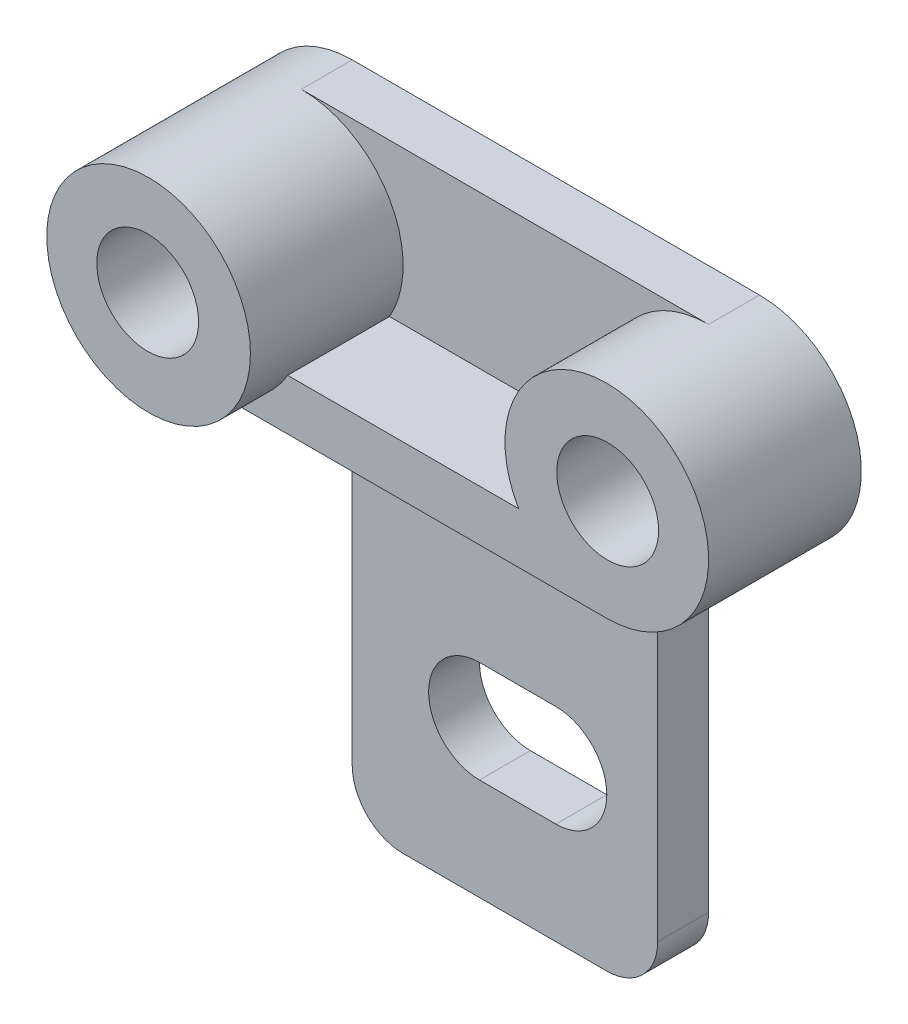
ISO-10303-21;
HEADER;
FILE_DESCRIPTION(('STEP AP214'),'2;1');
FILE_NAME('part.step','',(''),(''),'','','');
FILE_SCHEMA(('AUTOMOTIVE_DESIGN { 1 0 10303 214 1 1 1 1 }'));
ENDSEC;
DATA;
#1=APPLICATION_CONTEXT('core data for automotive mechanical design processes');
#2=APPLICATION_PROTOCOL_DEFINITION('international standard','automotive_design',2000,#1);
#3=PRODUCT_CONTEXT('',#1,'mechanical');
#4=PRODUCT('Part','Part','',(#3));
#5=PRODUCT_RELATED_PRODUCT_CATEGORY('part','',(#4));
#6=PRODUCT_DEFINITION_FORMATION('','',#4);
#7=PRODUCT_DEFINITION_CONTEXT('part definition',#1,'design');
#8=PRODUCT_DEFINITION('design','',#6,#7);
#9=PRODUCT_DEFINITION_SHAPE('','',#8);
#10=(LENGTH_UNIT() NAMED_UNIT(*) SI_UNIT(.MILLI.,.METRE.));
#11=(NAMED_UNIT(*) PLANE_ANGLE_UNIT() SI_UNIT($,.RADIAN.));
#12=(NAMED_UNIT(*) SI_UNIT($,.STERADIAN.) SOLID_ANGLE_UNIT());
#13=UNCERTAINTY_MEASURE_WITH_UNIT(LENGTH_MEASURE(1.E-05),#10,'distance_accuracy_value','');
#14=(GEOMETRIC_REPRESENTATION_CONTEXT(3) GLOBAL_UNCERTAINTY_ASSIGNED_CONTEXT((#13)) GLOBAL_UNIT_ASSIGNED_CONTEXT((#10,
#11,#12)) REPRESENTATION_CONTEXT('',''));
#15=CARTESIAN_POINT('',(0.,0.,0.));
#16=DIRECTION('',(0.,0.,1.));
#17=DIRECTION('',(1.,0.,0.));
#18=AXIS2_PLACEMENT_3D('',#15,#16,#17);
#19=CARTESIAN_POINT('',(-40.,0.,40.));
#20=DIRECTION('',(0.,0.,-1.));
#21=DIRECTION('',(-1.,0.,0.));
#22=AXIS2_PLACEMENT_3D('',#19,#20,#21);
#23=CYLINDRICAL_SURFACE('',#22,20.);
#24=CARTESIAN_POINT('',(-40.,0.,30.));
#25=DIRECTION('',(0.,0.,1.));
#26=DIRECTION('',(1.,0.,0.));
#27=AXIS2_PLACEMENT_3D('',#24,#25,#26);
#28=CIRCLE('',#27,20.);
#29=CARTESIAN_POINT('',(-40.,-20.,30.));
#30=VERTEX_POINT('',#29);
#31=CARTESIAN_POINT('',(-22.6794919243112,-9.99999999999999,30.));
#32=VERTEX_POINT('',#31);
#33=EDGE_CURVE('E260',#30,#32,#28,.T.);
#34=ORIENTED_EDGE('',*,*,#33,.T.);
#35=DIRECTION('',(0.,0.,-1.));
#36=VECTOR('',#35,1.);
#37=CARTESIAN_POINT('',(-22.6794919243112,-9.99999999999999,40.));
#38=LINE('',#37,#36);
#39=CARTESIAN_POINT('',(-22.6794919243112,-9.99999999999999,10.));
#40=VERTEX_POINT('',#39);
#41=EDGE_CURVE('E255',#32,#40,#38,.T.);
#42=ORIENTED_EDGE('',*,*,#41,.T.);
#43=CARTESIAN_POINT('',(-40.,0.,10.));
#44=DIRECTION('',(0.,0.,-1.));
#45=DIRECTION('',(-1.,0.,0.));
#46=AXIS2_PLACEMENT_3D('',#43,#44,#45);
#47=CIRCLE('',#46,20.);
#48=CARTESIAN_POINT('',(-40.,20.,10.));
#49=VERTEX_POINT('',#48);
#50=EDGE_CURVE('E50',#49,#40,#47,.T.);
#51=ORIENTED_EDGE('',*,*,#50,.F.);
#52=DIRECTION('',(0.,0.,-1.));
#53=VECTOR('',#52,1.);
#54=CARTESIAN_POINT('',(-40.,20.,10.));
#55=LINE('',#54,#53);
#56=CARTESIAN_POINT('',(-40.,20.,0.));
#57=VERTEX_POINT('',#56);
#58=EDGE_CURVE('E278',#49,#57,#55,.T.);
#59=ORIENTED_EDGE('',*,*,#58,.T.);
#60=CARTESIAN_POINT('',(-40.,0.,0.));
#61=DIRECTION('',(0.,0.,1.));
#62=DIRECTION('',(1.,0.,0.));
#63=AXIS2_PLACEMENT_3D('',#60,#61,#62);
#64=CIRCLE('',#63,20.);
#65=CARTESIAN_POINT('',(-40.,-20.,0.));
#66=VERTEX_POINT('',#65);
#67=EDGE_CURVE('E276',#57,#66,#64,.T.);
#68=ORIENTED_EDGE('',*,*,#67,.T.);
#69=DIRECTION('',(0.,0.,-1.));
#70=VECTOR('',#69,1.);
#71=CARTESIAN_POINT('',(-40.,-20.,10.));
#72=LINE('',#71,#70);
#73=EDGE_CURVE('E281',#30,#66,#72,.T.);
#74=ORIENTED_EDGE('',*,*,#73,.F.);
#75=EDGE_LOOP('',(#34,#42,#51,#59,#68,#74));
#76=FACE_BOUND('',#75,.T.);
#77=CARTESIAN_POINT('',(-40.,0.,40.));
#78=DIRECTION('',(0.,0.,1.));
#79=DIRECTION('',(1.,0.,0.));
#80=AXIS2_PLACEMENT_3D('',#77,#78,#79);
#81=CIRCLE('',#80,20.);
#82=CARTESIAN_POINT('',(-20.,0.,40.));
#83=VERTEX_POINT('',#82);
#84=EDGE_CURVE('E286',#83,#83,#81,.T.);
#85=ORIENTED_EDGE('',*,*,#84,.F.);
#86=EDGE_LOOP('',(#85));
#87=FACE_BOUND('',#86,.T.);
#88=ADVANCED_FACE('F39',(#76,#87),#23,.T.);
#89=CARTESIAN_POINT('',(-40.,0.,40.));
#90=DIRECTION('',(0.,0.,1.));
#91=DIRECTION('',(1.,0.,0.));
#92=AXIS2_PLACEMENT_3D('',#89,#90,#91);
#93=PLANE('',#92);
#94=CARTESIAN_POINT('',(-40.1782098015391,0.324017820980294,40.));
#95=DIRECTION('',(0.,0.,1.));
#96=DIRECTION('',(1.,0.,0.));
#97=AXIS2_PLACEMENT_3D('',#94,#95,#96);
#98=CIRCLE('',#97,9.99999999999999);
#99=CARTESIAN_POINT('',(-30.1782098015391,0.324017820980294,40.));
#100=VERTEX_POINT('',#99);
#101=EDGE_CURVE('E221',#100,#100,#98,.T.);
#102=ORIENTED_EDGE('',*,*,#101,.F.);
#103=EDGE_LOOP('',(#102));
#104=FACE_BOUND('',#103,.T.);
#105=ORIENTED_EDGE('',*,*,#84,.T.);
#106=EDGE_LOOP('',(#105));
#107=FACE_BOUND('',#106,.T.);
#108=ADVANCED_FACE('F346',(#104,#107),#93,.T.);
#109=CARTESIAN_POINT('',(-40.,0.,0.));
#110=DIRECTION('',(0.,0.,1.));
#111=DIRECTION('',(1.,0.,0.));
#112=AXIS2_PLACEMENT_3D('',#109,#110,#111);
#113=PLANE('',#112);
#114=DIRECTION('',(-1.,0.,0.));
#115=VECTOR('',#114,1.);
#116=CARTESIAN_POINT('',(-5.,-60.,0.));
#117=LINE('',#116,#115);
#118=CARTESIAN_POINT('',(10.,-60.,0.));
#119=VERTEX_POINT('',#118);
#120=CARTESIAN_POINT('',(-5.,-60.,0.));
#121=VERTEX_POINT('',#120);
#122=EDGE_CURVE('E159',#119,#121,#117,.T.);
#123=ORIENTED_EDGE('',*,*,#122,.T.);
#124=CARTESIAN_POINT('',(-5.,-70.,0.));
#125=DIRECTION('',(0.,0.,1.));
#126=DIRECTION('',(1.,0.,0.));
#127=AXIS2_PLACEMENT_3D('',#124,#125,#126);
#128=CIRCLE('',#127,10.);
#129=CARTESIAN_POINT('',(-5.,-80.,0.));
#130=VERTEX_POINT('',#129);
#131=EDGE_CURVE('E152',#121,#130,#128,.T.);
#132=ORIENTED_EDGE('',*,*,#131,.T.);
#133=DIRECTION('',(1.,0.,0.));
#134=VECTOR('',#133,1.);
#135=CARTESIAN_POINT('',(-5.,-80.,0.));
#136=LINE('',#135,#134);
#137=CARTESIAN_POINT('',(9.99999999999999,-80.,0.));
#138=VERTEX_POINT('',#137);
#139=EDGE_CURVE('E162',#130,#138,#136,.T.);
#140=ORIENTED_EDGE('',*,*,#139,.T.);
#141=CARTESIAN_POINT('',(10.,-70.,0.));
#142=DIRECTION('',(0.,0.,1.));
#143=DIRECTION('',(1.,0.,0.));
#144=AXIS2_PLACEMENT_3D('',#141,#142,#143);
#145=CIRCLE('',#144,10.);
#146=EDGE_CURVE('E53',#138,#119,#145,.T.);
#147=ORIENTED_EDGE('',*,*,#146,.T.);
#148=EDGE_LOOP('',(#123,#132,#140,#147));
#149=FACE_BOUND('',#148,.T.);
#150=CARTESIAN_POINT('',(-40.1782098015391,0.324017820980294,0.));
#151=DIRECTION('',(0.,0.,1.));
#152=DIRECTION('',(1.,0.,0.));
#153=AXIS2_PLACEMENT_3D('',#150,#151,#152);
#154=CIRCLE('',#153,9.99999999999999);
#155=CARTESIAN_POINT('',(-30.1782098015391,0.324017820980294,0.));
#156=VERTEX_POINT('',#155);
#157=EDGE_CURVE('E237',#156,#156,#154,.T.);
#158=ORIENTED_EDGE('',*,*,#157,.T.);
#159=EDGE_LOOP('',(#158));
#160=FACE_BOUND('',#159,.T.);
#161=CARTESIAN_POINT('',(40.1782098015391,1.39659253554238E-13,0.));
#162=DIRECTION('',(0.,0.,1.));
#163=DIRECTION('',(1.,0.,0.));
#164=AXIS2_PLACEMENT_3D('',#161,#162,#163);
#165=CIRCLE('',#164,9.99999999999999);
#166=CARTESIAN_POINT('',(50.1782098015391,1.39659253554238E-13,0.));
#167=VERTEX_POINT('',#166);
#168=EDGE_CURVE('E239',#167,#167,#165,.T.);
#169=ORIENTED_EDGE('',*,*,#168,.T.);
#170=EDGE_LOOP('',(#169));
#171=FACE_BOUND('',#170,.T.);
#172=DIRECTION('',(-1.,0.,0.));
#173=VECTOR('',#172,1.);
#174=CARTESIAN_POINT('',(40.,-20.,0.));
#175=LINE('',#174,#173);
#176=CARTESIAN_POINT('',(40.,-20.,0.));
#177=VERTEX_POINT('',#176);
#178=CARTESIAN_POINT('',(30.,-20.,0.));
#179=VERTEX_POINT('',#178);
#180=EDGE_CURVE('E275',#177,#179,#175,.T.);
#181=ORIENTED_EDGE('',*,*,#180,.T.);
#182=DIRECTION('',(0.,-1.,0.));
#183=VECTOR('',#182,1.);
#184=CARTESIAN_POINT('',(30.,-20.,0.));
#185=LINE('',#184,#183);
#186=CARTESIAN_POINT('',(30.,-89.9999999999999,0.));
#187=VERTEX_POINT('',#186);
#188=EDGE_CURVE('E183',#179,#187,#185,.T.);
#189=ORIENTED_EDGE('',*,*,#188,.T.);
#190=CARTESIAN_POINT('',(20.,-90.,0.));
#191=DIRECTION('',(0.,0.,-1.));
#192=DIRECTION('',(-1.,0.,0.));
#193=AXIS2_PLACEMENT_3D('',#190,#191,#192);
#194=CIRCLE('',#193,10.);
#195=CARTESIAN_POINT('',(19.9999999999999,-100.,0.));
#196=VERTEX_POINT('',#195);
#197=EDGE_CURVE('E209',#187,#196,#194,.T.);
#198=ORIENTED_EDGE('',*,*,#197,.T.);
#199=DIRECTION('',(-1.,0.,0.));
#200=VECTOR('',#199,1.);
#201=CARTESIAN_POINT('',(19.9999999999999,-100.,0.));
#202=LINE('',#201,#200);
#203=CARTESIAN_POINT('',(-19.9999999999999,-100.,0.));
#204=VERTEX_POINT('',#203);
#205=EDGE_CURVE('E213',#196,#204,#202,.T.);
#206=ORIENTED_EDGE('',*,*,#205,.T.);
#207=CARTESIAN_POINT('',(-20.,-90.,0.));
#208=DIRECTION('',(0.,0.,-1.));
#209=DIRECTION('',(-1.,0.,0.));
#210=AXIS2_PLACEMENT_3D('',#207,#208,#209);
#211=CIRCLE('',#210,10.);
#212=CARTESIAN_POINT('',(-30.,-89.9999999999999,0.));
#213=VERTEX_POINT('',#212);
#214=EDGE_CURVE('E216',#204,#213,#211,.T.);
#215=ORIENTED_EDGE('',*,*,#214,.T.);
#216=DIRECTION('',(0.,1.,0.));
#217=VECTOR('',#216,1.);
#218=CARTESIAN_POINT('',(-30.,-20.,0.));
#219=LINE('',#218,#217);
#220=CARTESIAN_POINT('',(-30.,-20.,0.));
#221=VERTEX_POINT('',#220);
#222=EDGE_CURVE('E195',#213,#221,#219,.T.);
#223=ORIENTED_EDGE('',*,*,#222,.T.);
#224=EDGE_CURVE('E262',#221,#66,#175,.T.);
#225=ORIENTED_EDGE('',*,*,#224,.T.);
#226=ORIENTED_EDGE('',*,*,#67,.F.);
#227=DIRECTION('',(1.,0.,0.));
#228=VECTOR('',#227,1.);
#229=CARTESIAN_POINT('',(40.,20.,0.));
#230=LINE('',#229,#228);
#231=CARTESIAN_POINT('',(40.,20.,0.));
#232=VERTEX_POINT('',#231);
#233=EDGE_CURVE('E271',#57,#232,#230,.T.);
#234=ORIENTED_EDGE('',*,*,#233,.T.);
#235=CARTESIAN_POINT('',(40.,0.,0.));
#236=DIRECTION('',(0.,0.,1.));
#237=DIRECTION('',(1.,0.,0.));
#238=AXIS2_PLACEMENT_3D('',#235,#236,#237);
#239=CIRCLE('',#238,20.);
#240=EDGE_CURVE('E257',#177,#232,#239,.T.);
#241=ORIENTED_EDGE('',*,*,#240,.F.);
#242=EDGE_LOOP('',(#181,#189,#198,#206,#215,#223,#225,#226,#234,#241));
#243=FACE_BOUND('',#242,.T.);
#244=ADVANCED_FACE('F170',(#149,#160,#171,#243),#113,.F.);
#245=CARTESIAN_POINT('',(40.,20.,10.));
#246=DIRECTION('',(0.,1.,0.));
#247=DIRECTION('',(0.,0.,1.));
#248=AXIS2_PLACEMENT_3D('',#245,#246,#247);
#249=PLANE('',#248);
#250=ORIENTED_EDGE('',*,*,#233,.F.);
#251=ORIENTED_EDGE('',*,*,#58,.F.);
#252=DIRECTION('',(1.,0.,0.));
#253=VECTOR('',#252,1.);
#254=CARTESIAN_POINT('',(40.,20.,10.));
#255=LINE('',#254,#253);
#256=CARTESIAN_POINT('',(40.,20.,10.));
#257=VERTEX_POINT('',#256);
#258=EDGE_CURVE('E270',#49,#257,#255,.T.);
#259=ORIENTED_EDGE('',*,*,#258,.T.);
#260=DIRECTION('',(0.,0.,-1.));
#261=VECTOR('',#260,1.);
#262=CARTESIAN_POINT('',(40.,20.,10.));
#263=LINE('',#262,#261);
#264=EDGE_CURVE('E280',#257,#232,#263,.T.);
#265=ORIENTED_EDGE('',*,*,#264,.T.);
#266=EDGE_LOOP('',(#250,#251,#259,#265));
#267=FACE_BOUND('',#266,.T.);
#268=ADVANCED_FACE('F301',(#267),#249,.T.);
#269=CARTESIAN_POINT('',(40.,-20.,10.));
#270=DIRECTION('',(0.,-1.,0.));
#271=DIRECTION('',(0.,0.,-1.));
#272=AXIS2_PLACEMENT_3D('',#269,#270,#271);
#273=PLANE('',#272);
#274=DIRECTION('',(0.,0.,-1.));
#275=VECTOR('',#274,1.);
#276=CARTESIAN_POINT('',(-30.,-20.,10.));
#277=LINE('',#276,#275);
#278=CARTESIAN_POINT('',(-30.,-20.,10.));
#279=VERTEX_POINT('',#278);
#280=EDGE_CURVE('E223',#279,#221,#277,.T.);
#281=ORIENTED_EDGE('',*,*,#280,.F.);
#282=DIRECTION('',(1.,0.,0.));
#283=VECTOR('',#282,1.);
#284=CARTESIAN_POINT('',(30.,-20.,10.));
#285=LINE('',#284,#283);
#286=CARTESIAN_POINT('',(30.,-20.,10.));
#287=VERTEX_POINT('',#286);
#288=EDGE_CURVE('E204',#279,#287,#285,.T.);
#289=ORIENTED_EDGE('',*,*,#288,.T.);
#290=DIRECTION('',(0.,0.,-1.));
#291=VECTOR('',#290,1.);
#292=CARTESIAN_POINT('',(30.,-20.,10.));
#293=LINE('',#292,#291);
#294=EDGE_CURVE('E222',#287,#179,#293,.T.);
#295=ORIENTED_EDGE('',*,*,#294,.T.);
#296=ORIENTED_EDGE('',*,*,#180,.F.);
#297=DIRECTION('',(0.,0.,-1.));
#298=VECTOR('',#297,1.);
#299=CARTESIAN_POINT('',(40.,-20.,10.));
#300=LINE('',#299,#298);
#301=CARTESIAN_POINT('',(40.,-20.,30.));
#302=VERTEX_POINT('',#301);
#303=EDGE_CURVE('E269',#302,#177,#300,.T.);
#304=ORIENTED_EDGE('',*,*,#303,.F.);
#305=DIRECTION('',(1.,0.,0.));
#306=VECTOR('',#305,1.);
#307=CARTESIAN_POINT('',(-40.,-20.,30.));
#308=LINE('',#307,#306);
#309=EDGE_CURVE('E241',#30,#302,#308,.T.);
#310=ORIENTED_EDGE('',*,*,#309,.F.);
#311=ORIENTED_EDGE('',*,*,#73,.T.);
#312=ORIENTED_EDGE('',*,*,#224,.F.);
#313=EDGE_LOOP('',(#281,#289,#295,#296,#304,#310,#311,#312));
#314=FACE_BOUND('',#313,.T.);
#315=ADVANCED_FACE('F315',(#314),#273,.T.);
#316=CARTESIAN_POINT('',(0.,0.,10.));
#317=DIRECTION('',(0.,0.,-1.));
#318=DIRECTION('',(-1.,0.,0.));
#319=AXIS2_PLACEMENT_3D('',#316,#317,#318);
#320=PLANE('',#319);
#321=ORIENTED_EDGE('',*,*,#50,.T.);
#322=DIRECTION('',(1.,0.,0.));
#323=VECTOR('',#322,1.);
#324=CARTESIAN_POINT('',(0.,-9.99999999999999,10.));
#325=LINE('',#324,#323);
#326=CARTESIAN_POINT('',(22.6794919243112,-9.99999999999999,10.));
#327=VERTEX_POINT('',#326);
#328=EDGE_CURVE('E253',#40,#327,#325,.T.);
#329=ORIENTED_EDGE('',*,*,#328,.T.);
#330=CARTESIAN_POINT('',(40.,0.,10.));
#331=DIRECTION('',(0.,0.,-1.));
#332=DIRECTION('',(-1.,0.,0.));
#333=AXIS2_PLACEMENT_3D('',#330,#331,#332);
#334=CIRCLE('',#333,20.);
#335=EDGE_CURVE('E11',#257,#327,#334,.F.);
#336=ORIENTED_EDGE('',*,*,#335,.F.);
#337=ORIENTED_EDGE('',*,*,#258,.F.);
#338=EDGE_LOOP('',(#321,#329,#336,#337));
#339=FACE_BOUND('',#338,.T.);
#340=ADVANCED_FACE('F293',(#339),#320,.F.);
#341=CARTESIAN_POINT('',(40.,0.,30.));
#342=DIRECTION('',(0.,0.,-1.));
#343=DIRECTION('',(-1.,0.,0.));
#344=AXIS2_PLACEMENT_3D('',#341,#342,#343);
#345=CYLINDRICAL_SURFACE('',#344,20.);
#346=ORIENTED_EDGE('',*,*,#335,.T.);
#347=DIRECTION('',(0.,0.,-1.));
#348=VECTOR('',#347,1.);
#349=CARTESIAN_POINT('',(22.6794919243112,-9.99999999999999,30.));
#350=LINE('',#349,#348);
#351=CARTESIAN_POINT('',(22.6794919243112,-9.99999999999999,30.));
#352=VERTEX_POINT('',#351);
#353=EDGE_CURVE('E250',#327,#352,#350,.F.);
#354=ORIENTED_EDGE('',*,*,#353,.T.);
#355=CARTESIAN_POINT('',(40.,0.,30.));
#356=DIRECTION('',(0.,0.,1.));
#357=DIRECTION('',(1.,0.,0.));
#358=AXIS2_PLACEMENT_3D('',#355,#356,#357);
#359=CIRCLE('',#358,20.);
#360=EDGE_CURVE('E261',#302,#352,#359,.T.);
#361=ORIENTED_EDGE('',*,*,#360,.F.);
#362=ORIENTED_EDGE('',*,*,#303,.T.);
#363=ORIENTED_EDGE('',*,*,#240,.T.);
#364=ORIENTED_EDGE('',*,*,#264,.F.);
#365=EDGE_LOOP('',(#346,#354,#361,#362,#363,#364));
#366=FACE_BOUND('',#365,.T.);
#367=ADVANCED_FACE('F307',(#366),#345,.T.);
#368=CARTESIAN_POINT('',(40.,0.,30.));
#369=DIRECTION('',(0.,0.,1.));
#370=DIRECTION('',(1.,0.,0.));
#371=AXIS2_PLACEMENT_3D('',#368,#369,#370);
#372=PLANE('',#371);
#373=CARTESIAN_POINT('',(40.1782098015391,1.39659253554238E-13,30.));
#374=DIRECTION('',(0.,0.,1.));
#375=DIRECTION('',(1.,0.,0.));
#376=AXIS2_PLACEMENT_3D('',#373,#374,#375);
#377=CIRCLE('',#376,9.99999999999999);
#378=CARTESIAN_POINT('',(50.1782098015391,1.39659253554238E-13,30.));
#379=VERTEX_POINT('',#378);
#380=EDGE_CURVE('E45',#379,#379,#377,.T.);
#381=ORIENTED_EDGE('',*,*,#380,.F.);
#382=EDGE_LOOP('',(#381));
#383=FACE_BOUND('',#382,.T.);
#384=ORIENTED_EDGE('',*,*,#360,.T.);
#385=DIRECTION('',(-1.,0.,0.));
#386=VECTOR('',#385,1.);
#387=CARTESIAN_POINT('',(-40.,-9.99999999999999,30.));
#388=LINE('',#387,#386);
#389=EDGE_CURVE('E242',#352,#32,#388,.T.);
#390=ORIENTED_EDGE('',*,*,#389,.T.);
#391=ORIENTED_EDGE('',*,*,#33,.F.);
#392=ORIENTED_EDGE('',*,*,#309,.T.);
#393=EDGE_LOOP('',(#384,#390,#391,#392));
#394=FACE_BOUND('',#393,.T.);
#395=ADVANCED_FACE('F312',(#383,#394),#372,.T.);
#396=CARTESIAN_POINT('',(-40.,-9.99999999999999,0.));
#397=DIRECTION('',(0.,1.,0.));
#398=DIRECTION('',(0.,0.,1.));
#399=AXIS2_PLACEMENT_3D('',#396,#397,#398);
#400=PLANE('',#399);
#401=ORIENTED_EDGE('',*,*,#41,.F.);
#402=ORIENTED_EDGE('',*,*,#389,.F.);
#403=ORIENTED_EDGE('',*,*,#353,.F.);
#404=ORIENTED_EDGE('',*,*,#328,.F.);
#405=EDGE_LOOP('',(#401,#402,#403,#404));
#406=FACE_BOUND('',#405,.T.);
#407=ADVANCED_FACE('F371',(#406),#400,.T.);
#408=CARTESIAN_POINT('',(40.1782098015391,1.39659253554238E-13,40.));
#409=DIRECTION('',(0.,0.,1.));
#410=DIRECTION('',(1.,0.,0.));
#411=AXIS2_PLACEMENT_3D('',#408,#409,#410);
#412=CYLINDRICAL_SURFACE('',#411,9.99999999999999);
#413=ORIENTED_EDGE('',*,*,#380,.T.);
#414=EDGE_LOOP('',(#413));
#415=FACE_BOUND('',#414,.T.);
#416=ORIENTED_EDGE('',*,*,#168,.F.);
#417=EDGE_LOOP('',(#416));
#418=FACE_BOUND('',#417,.T.);
#419=ADVANCED_FACE('F372',(#415,#418),#412,.F.);
#420=CARTESIAN_POINT('',(-40.1782098015391,0.324017820980294,40.));
#421=DIRECTION('',(0.,0.,1.));
#422=DIRECTION('',(1.,0.,0.));
#423=AXIS2_PLACEMENT_3D('',#420,#421,#422);
#424=CYLINDRICAL_SURFACE('',#423,9.99999999999999);
#425=ORIENTED_EDGE('',*,*,#157,.F.);
#426=EDGE_LOOP('',(#425));
#427=FACE_BOUND('',#426,.T.);
#428=ORIENTED_EDGE('',*,*,#101,.T.);
#429=EDGE_LOOP('',(#428));
#430=FACE_BOUND('',#429,.T.);
#431=ADVANCED_FACE('F378',(#427,#430),#424,.F.);
#432=CARTESIAN_POINT('',(30.,-20.,10.));
#433=DIRECTION('',(1.,0.,0.));
#434=DIRECTION('',(0.,1.,0.));
#435=AXIS2_PLACEMENT_3D('',#432,#433,#434);
#436=PLANE('',#435);
#437=ORIENTED_EDGE('',*,*,#188,.F.);
#438=ORIENTED_EDGE('',*,*,#294,.F.);
#439=DIRECTION('',(0.,-1.,0.));
#440=VECTOR('',#439,1.);
#441=CARTESIAN_POINT('',(30.,-20.,10.));
#442=LINE('',#441,#440);
#443=CARTESIAN_POINT('',(30.,-89.9999999999999,10.));
#444=VERTEX_POINT('',#443);
#445=EDGE_CURVE('E188',#287,#444,#442,.T.);
#446=ORIENTED_EDGE('',*,*,#445,.T.);
#447=DIRECTION('',(0.,0.,-1.));
#448=VECTOR('',#447,1.);
#449=CARTESIAN_POINT('',(30.,-89.9999999999999,10.));
#450=LINE('',#449,#448);
#451=EDGE_CURVE('E210',#444,#187,#450,.T.);
#452=ORIENTED_EDGE('',*,*,#451,.T.);
#453=EDGE_LOOP('',(#437,#438,#446,#452));
#454=FACE_BOUND('',#453,.T.);
#455=ADVANCED_FACE('F329',(#454),#436,.T.);
#456=CARTESIAN_POINT('',(-30.,-20.,10.));
#457=DIRECTION('',(-1.,0.,0.));
#458=DIRECTION('',(0.,-1.,0.));
#459=AXIS2_PLACEMENT_3D('',#456,#457,#458);
#460=PLANE('',#459);
#461=ORIENTED_EDGE('',*,*,#222,.F.);
#462=DIRECTION('',(0.,0.,-1.));
#463=VECTOR('',#462,1.);
#464=CARTESIAN_POINT('',(-30.,-89.9999999999999,10.));
#465=LINE('',#464,#463);
#466=CARTESIAN_POINT('',(-30.,-89.9999999999999,10.));
#467=VERTEX_POINT('',#466);
#468=EDGE_CURVE('E226',#467,#213,#465,.T.);
#469=ORIENTED_EDGE('',*,*,#468,.F.);
#470=DIRECTION('',(0.,1.,0.));
#471=VECTOR('',#470,1.);
#472=CARTESIAN_POINT('',(-30.,-20.,10.));
#473=LINE('',#472,#471);
#474=EDGE_CURVE('E205',#467,#279,#473,.T.);
#475=ORIENTED_EDGE('',*,*,#474,.T.);
#476=ORIENTED_EDGE('',*,*,#280,.T.);
#477=EDGE_LOOP('',(#461,#469,#475,#476));
#478=FACE_BOUND('',#477,.T.);
#479=ADVANCED_FACE('F319',(#478),#460,.T.);
#480=CARTESIAN_POINT('',(-20.,-90.,10.));
#481=DIRECTION('',(0.,0.,-1.));
#482=DIRECTION('',(-1.,0.,0.));
#483=AXIS2_PLACEMENT_3D('',#480,#481,#482);
#484=CYLINDRICAL_SURFACE('',#483,10.);
#485=ORIENTED_EDGE('',*,*,#214,.F.);
#486=DIRECTION('',(0.,0.,-1.));
#487=VECTOR('',#486,1.);
#488=CARTESIAN_POINT('',(-19.9999999999999,-100.,10.));
#489=LINE('',#488,#487);
#490=CARTESIAN_POINT('',(-19.9999999999999,-100.,10.));
#491=VERTEX_POINT('',#490);
#492=EDGE_CURVE('E228',#491,#204,#489,.T.);
#493=ORIENTED_EDGE('',*,*,#492,.F.);
#494=CARTESIAN_POINT('',(-20.,-90.,10.));
#495=DIRECTION('',(0.,0.,-1.));
#496=DIRECTION('',(-1.,0.,0.));
#497=AXIS2_PLACEMENT_3D('',#494,#495,#496);
#498=CIRCLE('',#497,10.);
#499=EDGE_CURVE('E200',#491,#467,#498,.T.);
#500=ORIENTED_EDGE('',*,*,#499,.T.);
#501=ORIENTED_EDGE('',*,*,#468,.T.);
#502=EDGE_LOOP('',(#485,#493,#500,#501));
#503=FACE_BOUND('',#502,.T.);
#504=ADVANCED_FACE('F340',(#503),#484,.T.);
#505=CARTESIAN_POINT('',(19.9999999999999,-100.,10.));
#506=DIRECTION('',(0.,-1.,0.));
#507=DIRECTION('',(0.,0.,-1.));
#508=AXIS2_PLACEMENT_3D('',#505,#506,#507);
#509=PLANE('',#508);
#510=ORIENTED_EDGE('',*,*,#205,.F.);
#511=DIRECTION('',(0.,0.,-1.));
#512=VECTOR('',#511,1.);
#513=CARTESIAN_POINT('',(19.9999999999999,-100.,10.));
#514=LINE('',#513,#512);
#515=CARTESIAN_POINT('',(19.9999999999999,-100.,10.));
#516=VERTEX_POINT('',#515);
#517=EDGE_CURVE('E234',#516,#196,#514,.T.);
#518=ORIENTED_EDGE('',*,*,#517,.F.);
#519=DIRECTION('',(-1.,0.,0.));
#520=VECTOR('',#519,1.);
#521=CARTESIAN_POINT('',(19.9999999999999,-100.,10.));
#522=LINE('',#521,#520);
#523=EDGE_CURVE('E198',#516,#491,#522,.T.);
#524=ORIENTED_EDGE('',*,*,#523,.T.);
#525=ORIENTED_EDGE('',*,*,#492,.T.);
#526=EDGE_LOOP('',(#510,#518,#524,#525));
#527=FACE_BOUND('',#526,.T.);
#528=ADVANCED_FACE('F339',(#527),#509,.T.);
#529=CARTESIAN_POINT('',(20.,-90.,10.));
#530=DIRECTION('',(0.,0.,-1.));
#531=DIRECTION('',(-1.,0.,0.));
#532=AXIS2_PLACEMENT_3D('',#529,#530,#531);
#533=CYLINDRICAL_SURFACE('',#532,10.);
#534=ORIENTED_EDGE('',*,*,#197,.F.);
#535=ORIENTED_EDGE('',*,*,#451,.F.);
#536=CARTESIAN_POINT('',(20.,-90.,10.));
#537=DIRECTION('',(0.,0.,-1.));
#538=DIRECTION('',(-1.,0.,0.));
#539=AXIS2_PLACEMENT_3D('',#536,#537,#538);
#540=CIRCLE('',#539,10.);
#541=EDGE_CURVE('E191',#444,#516,#540,.T.);
#542=ORIENTED_EDGE('',*,*,#541,.T.);
#543=ORIENTED_EDGE('',*,*,#517,.T.);
#544=EDGE_LOOP('',(#534,#535,#542,#543));
#545=FACE_BOUND('',#544,.T.);
#546=ADVANCED_FACE('F335',(#545),#533,.T.);
#547=CARTESIAN_POINT('',(20.,-90.,10.));
#548=DIRECTION('',(0.,0.,-1.));
#549=DIRECTION('',(-1.,0.,0.));
#550=AXIS2_PLACEMENT_3D('',#547,#548,#549);
#551=PLANE('',#550);
#552=DIRECTION('',(1.,0.,0.));
#553=VECTOR('',#552,1.);
#554=CARTESIAN_POINT('',(-5.,-80.,10.));
#555=LINE('',#554,#553);
#556=CARTESIAN_POINT('',(-5.,-80.,10.));
#557=VERTEX_POINT('',#556);
#558=CARTESIAN_POINT('',(10.,-80.,10.));
#559=VERTEX_POINT('',#558);
#560=EDGE_CURVE('E178',#557,#559,#555,.T.);
#561=ORIENTED_EDGE('',*,*,#560,.F.);
#562=CARTESIAN_POINT('',(-5.,-70.,10.));
#563=DIRECTION('',(0.,0.,1.));
#564=DIRECTION('',(1.,0.,0.));
#565=AXIS2_PLACEMENT_3D('',#562,#563,#564);
#566=CIRCLE('',#565,10.);
#567=CARTESIAN_POINT('',(-5.,-60.,10.));
#568=VERTEX_POINT('',#567);
#569=EDGE_CURVE('E61',#568,#557,#566,.T.);
#570=ORIENTED_EDGE('',*,*,#569,.F.);
#571=DIRECTION('',(-1.,0.,0.));
#572=VECTOR('',#571,1.);
#573=CARTESIAN_POINT('',(-5.,-60.,10.));
#574=LINE('',#573,#572);
#575=CARTESIAN_POINT('',(10.,-60.,10.));
#576=VERTEX_POINT('',#575);
#577=EDGE_CURVE('E168',#576,#568,#574,.T.);
#578=ORIENTED_EDGE('',*,*,#577,.F.);
#579=CARTESIAN_POINT('',(10.,-70.,10.));
#580=DIRECTION('',(0.,0.,1.));
#581=DIRECTION('',(1.,0.,0.));
#582=AXIS2_PLACEMENT_3D('',#579,#580,#581);
#583=CIRCLE('',#582,10.);
#584=EDGE_CURVE('E175',#559,#576,#583,.T.);
#585=ORIENTED_EDGE('',*,*,#584,.F.);
#586=EDGE_LOOP('',(#561,#570,#578,#585));
#587=FACE_BOUND('',#586,.T.);
#588=ORIENTED_EDGE('',*,*,#445,.F.);
#589=ORIENTED_EDGE('',*,*,#288,.F.);
#590=ORIENTED_EDGE('',*,*,#474,.F.);
#591=ORIENTED_EDGE('',*,*,#499,.F.);
#592=ORIENTED_EDGE('',*,*,#523,.F.);
#593=ORIENTED_EDGE('',*,*,#541,.F.);
#594=EDGE_LOOP('',(#588,#589,#590,#591,#592,#593));
#595=FACE_BOUND('',#594,.T.);
#596=ADVANCED_FACE('F324',(#587,#595),#551,.F.);
#597=CARTESIAN_POINT('',(-5.,-70.,0.));
#598=DIRECTION('',(0.,0.,1.));
#599=DIRECTION('',(1.,0.,0.));
#600=AXIS2_PLACEMENT_3D('',#597,#598,#599);
#601=CYLINDRICAL_SURFACE('',#600,10.);
#602=ORIENTED_EDGE('',*,*,#569,.T.);
#603=DIRECTION('',(0.,0.,1.));
#604=VECTOR('',#603,1.);
#605=CARTESIAN_POINT('',(-5.,-80.,0.));
#606=LINE('',#605,#604);
#607=EDGE_CURVE('E147',#130,#557,#606,.T.);
#608=ORIENTED_EDGE('',*,*,#607,.F.);
#609=ORIENTED_EDGE('',*,*,#131,.F.);
#610=DIRECTION('',(0.,0.,1.));
#611=VECTOR('',#610,1.);
#612=CARTESIAN_POINT('',(-5.,-60.,0.));
#613=LINE('',#612,#611);
#614=EDGE_CURVE('E181',#121,#568,#613,.T.);
#615=ORIENTED_EDGE('',*,*,#614,.T.);
#616=EDGE_LOOP('',(#602,#608,#609,#615));
#617=FACE_BOUND('',#616,.T.);
#618=ADVANCED_FACE('F155',(#617),#601,.F.);
#619=CARTESIAN_POINT('',(-5.,-60.,0.));
#620=DIRECTION('',(0.,1.,0.));
#621=DIRECTION('',(0.,0.,1.));
#622=AXIS2_PLACEMENT_3D('',#619,#620,#621);
#623=PLANE('',#622);
#624=ORIENTED_EDGE('',*,*,#577,.T.);
#625=ORIENTED_EDGE('',*,*,#614,.F.);
#626=ORIENTED_EDGE('',*,*,#122,.F.);
#627=DIRECTION('',(0.,0.,1.));
#628=VECTOR('',#627,1.);
#629=CARTESIAN_POINT('',(10.,-60.,0.));
#630=LINE('',#629,#628);
#631=EDGE_CURVE('E189',#119,#576,#630,.T.);
#632=ORIENTED_EDGE('',*,*,#631,.T.);
#633=EDGE_LOOP('',(#624,#625,#626,#632));
#634=FACE_BOUND('',#633,.T.);
#635=ADVANCED_FACE('F393',(#634),#623,.F.);
#636=CARTESIAN_POINT('',(10.,-70.,0.));
#637=DIRECTION('',(0.,0.,1.));
#638=DIRECTION('',(1.,0.,0.));
#639=AXIS2_PLACEMENT_3D('',#636,#637,#638);
#640=CYLINDRICAL_SURFACE('',#639,10.);
#641=ORIENTED_EDGE('',*,*,#584,.T.);
#642=ORIENTED_EDGE('',*,*,#631,.F.);
#643=ORIENTED_EDGE('',*,*,#146,.F.);
#644=DIRECTION('',(0.,0.,1.));
#645=VECTOR('',#644,1.);
#646=CARTESIAN_POINT('',(10.,-80.,0.));
#647=LINE('',#646,#645);
#648=EDGE_CURVE('E157',#138,#559,#647,.T.);
#649=ORIENTED_EDGE('',*,*,#648,.T.);
#650=EDGE_LOOP('',(#641,#642,#643,#649));
#651=FACE_BOUND('',#650,.T.);
#652=ADVANCED_FACE('F398',(#651),#640,.F.);
#653=CARTESIAN_POINT('',(-5.,-80.,0.));
#654=DIRECTION('',(0.,-1.,0.));
#655=DIRECTION('',(0.,0.,-1.));
#656=AXIS2_PLACEMENT_3D('',#653,#654,#655);
#657=PLANE('',#656);
#658=ORIENTED_EDGE('',*,*,#560,.T.);
#659=ORIENTED_EDGE('',*,*,#648,.F.);
#660=ORIENTED_EDGE('',*,*,#139,.F.);
#661=ORIENTED_EDGE('',*,*,#607,.T.);
#662=EDGE_LOOP('',(#658,#659,#660,#661));
#663=FACE_BOUND('',#662,.T.);
#664=ADVANCED_FACE('F163',(#663),#657,.F.);
#665=CLOSED_SHELL('',(#88,#108,#244,#268,#315,#340,#367,#395,#407,#419,#431,#455,#479,#504,#528,
#546,#596,#618,#635,#652,#664));
#666=MANIFOLD_SOLID_BREP('B2',#665);
#667=ADVANCED_BREP_SHAPE_REPRESENTATION('',(#18,#666),#14);
#668=SHAPE_DEFINITION_REPRESENTATION(#9,#667);
ENDSEC;
END-ISO-10303-21;
